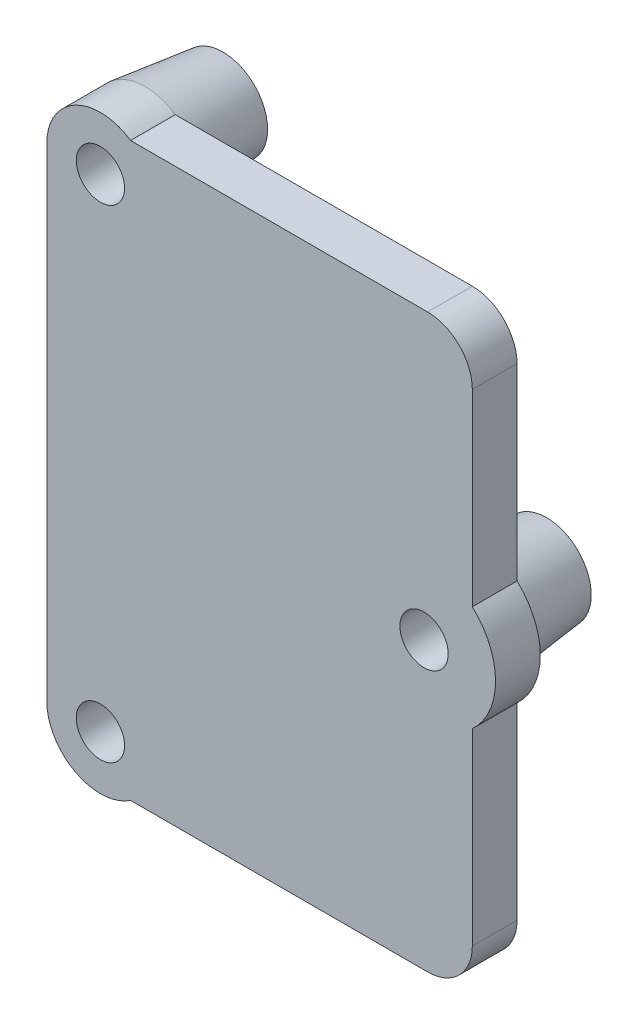
ISO-10303-21;
HEADER;
FILE_DESCRIPTION(('STEP AP214'),'2;1');
FILE_NAME('part.step','',(''),(''),'','','');
FILE_SCHEMA(('AUTOMOTIVE_DESIGN { 1 0 10303 214 1 1 1 1 }'));
ENDSEC;
DATA;
#1=APPLICATION_CONTEXT('core data for automotive mechanical design processes');
#2=APPLICATION_PROTOCOL_DEFINITION('international standard','automotive_design',2000,#1);
#3=PRODUCT_CONTEXT('',#1,'mechanical');
#4=PRODUCT('Part','Part','',(#3));
#5=PRODUCT_RELATED_PRODUCT_CATEGORY('part','',(#4));
#6=PRODUCT_DEFINITION_FORMATION('','',#4);
#7=PRODUCT_DEFINITION_CONTEXT('part definition',#1,'design');
#8=PRODUCT_DEFINITION('design','',#6,#7);
#9=PRODUCT_DEFINITION_SHAPE('','',#8);
#10=(LENGTH_UNIT() NAMED_UNIT(*) SI_UNIT(.MILLI.,.METRE.));
#11=(NAMED_UNIT(*) PLANE_ANGLE_UNIT() SI_UNIT($,.RADIAN.));
#12=(NAMED_UNIT(*) SI_UNIT($,.STERADIAN.) SOLID_ANGLE_UNIT());
#13=UNCERTAINTY_MEASURE_WITH_UNIT(LENGTH_MEASURE(1.E-05),#10,'distance_accuracy_value','');
#14=(GEOMETRIC_REPRESENTATION_CONTEXT(3) GLOBAL_UNCERTAINTY_ASSIGNED_CONTEXT((#13)) GLOBAL_UNIT_ASSIGNED_CONTEXT((#10,
#11,#12)) REPRESENTATION_CONTEXT('',''));
#15=CARTESIAN_POINT('',(0.,0.,0.));
#16=DIRECTION('',(0.,0.,1.));
#17=DIRECTION('',(1.,0.,0.));
#18=AXIS2_PLACEMENT_3D('',#15,#16,#17);
#19=CARTESIAN_POINT('',(0.,0.,0.));
#20=DIRECTION('',(0.,0.,1.));
#21=DIRECTION('',(1.,0.,0.));
#22=AXIS2_PLACEMENT_3D('',#19,#20,#21);
#23=PLANE('',#22);
#24=DIRECTION('',(-1.,0.,0.));
#25=VECTOR('',#24,1.);
#26=CARTESIAN_POINT('',(0.,31.963697294173,0.));
#27=LINE('',#26,#25);
#28=CARTESIAN_POINT('',(18.5,31.963697294173,0.));
#29=VERTEX_POINT('',#28);
#30=CARTESIAN_POINT('',(-14.729286548545,31.963697294173,0.));
#31=VERTEX_POINT('',#30);
#32=EDGE_CURVE('E145',#29,#31,#27,.T.);
#33=ORIENTED_EDGE('',*,*,#32,.F.);
#34=CARTESIAN_POINT('',(18.5,26.963697294173,0.));
#35=DIRECTION('',(0.,0.,1.));
#36=DIRECTION('',(1.,0.,0.));
#37=AXIS2_PLACEMENT_3D('',#34,#35,#36);
#38=CIRCLE('',#37,5.);
#39=CARTESIAN_POINT('',(23.5,26.963697294173,0.));
#40=VERTEX_POINT('',#39);
#41=EDGE_CURVE('E141',#29,#40,#38,.F.);
#42=ORIENTED_EDGE('',*,*,#41,.T.);
#43=DIRECTION('',(0.,-1.,0.));
#44=VECTOR('',#43,1.);
#45=CARTESIAN_POINT('',(23.5,0.,0.));
#46=LINE('',#45,#44);
#47=CARTESIAN_POINT('',(23.5,5.90254182534947,0.));
#48=VERTEX_POINT('',#47);
#49=EDGE_CURVE('E134',#40,#48,#46,.T.);
#50=ORIENTED_EDGE('',*,*,#49,.T.);
#51=CARTESIAN_POINT('',(18.1,0.,0.));
#52=DIRECTION('',(0.,0.,1.));
#53=DIRECTION('',(1.,0.,0.));
#54=AXIS2_PLACEMENT_3D('',#51,#52,#53);
#55=CIRCLE('',#54,7.99999999999999);
#56=CARTESIAN_POINT('',(23.5,-5.90254182534947,0.));
#57=VERTEX_POINT('',#56);
#58=EDGE_CURVE('E139',#57,#48,#55,.T.);
#59=ORIENTED_EDGE('',*,*,#58,.F.);
#60=DIRECTION('',(0.,-1.,0.));
#61=VECTOR('',#60,1.);
#62=CARTESIAN_POINT('',(23.5,0.,0.));
#63=LINE('',#62,#61);
#64=CARTESIAN_POINT('',(23.5,-26.963697294173,0.));
#65=VERTEX_POINT('',#64);
#66=EDGE_CURVE('E218',#57,#65,#63,.T.);
#67=ORIENTED_EDGE('',*,*,#66,.T.);
#68=CARTESIAN_POINT('',(18.5,-26.963697294173,0.));
#69=DIRECTION('',(0.,0.,1.));
#70=DIRECTION('',(1.,0.,0.));
#71=AXIS2_PLACEMENT_3D('',#68,#69,#70);
#72=CIRCLE('',#71,5.);
#73=CARTESIAN_POINT('',(18.5,-31.963697294173,0.));
#74=VERTEX_POINT('',#73);
#75=EDGE_CURVE('E74',#65,#74,#72,.F.);
#76=ORIENTED_EDGE('',*,*,#75,.T.);
#77=DIRECTION('',(-1.,0.,0.));
#78=VECTOR('',#77,1.);
#79=CARTESIAN_POINT('',(0.,-31.963697294173,0.));
#80=LINE('',#79,#78);
#81=CARTESIAN_POINT('',(-14.729286548545,-31.963697294173,0.));
#82=VERTEX_POINT('',#81);
#83=EDGE_CURVE('E205',#74,#82,#80,.T.);
#84=ORIENTED_EDGE('',*,*,#83,.T.);
#85=CARTESIAN_POINT('',(-18.1,-27.,0.));
#86=DIRECTION('',(0.,0.,1.));
#87=DIRECTION('',(1.,0.,0.));
#88=AXIS2_PLACEMENT_3D('',#85,#86,#87);
#89=CIRCLE('',#88,6.);
#90=CARTESIAN_POINT('',(-24.1,-27.,0.));
#91=VERTEX_POINT('',#90);
#92=EDGE_CURVE('E184',#91,#82,#89,.F.);
#93=ORIENTED_EDGE('',*,*,#92,.F.);
#94=DIRECTION('',(0.,-1.,0.));
#95=VECTOR('',#94,1.);
#96=CARTESIAN_POINT('',(-24.1000000000001,-27.0000000000003,0.));
#97=LINE('',#96,#95);
#98=CARTESIAN_POINT('',(-24.1000000000001,27.,5.20417042793042E-13));
#99=VERTEX_POINT('',#98);
#100=EDGE_CURVE('E229',#99,#91,#97,.T.);
#101=ORIENTED_EDGE('',*,*,#100,.F.);
#102=CARTESIAN_POINT('',(-18.1,27.,0.));
#103=DIRECTION('',(0.,0.,1.));
#104=DIRECTION('',(1.,0.,0.));
#105=AXIS2_PLACEMENT_3D('',#102,#103,#104);
#106=CIRCLE('',#105,6.);
#107=EDGE_CURVE('E175',#99,#31,#106,.T.);
#108=ORIENTED_EDGE('',*,*,#107,.T.);
#109=EDGE_LOOP('',(#33,#42,#50,#59,#67,#76,#84,#93,#101,#108));
#110=FACE_BOUND('',#109,.T.);
#111=CARTESIAN_POINT('',(18.1,0.,0.));
#112=DIRECTION('',(0.,0.,1.));
#113=DIRECTION('',(1.,0.,0.));
#114=AXIS2_PLACEMENT_3D('',#111,#112,#113);
#115=CIRCLE('',#114,6.);
#116=CARTESIAN_POINT('',(24.1,0.,0.));
#117=VERTEX_POINT('',#116);
#118=EDGE_CURVE('E188',#117,#117,#115,.F.);
#119=ORIENTED_EDGE('',*,*,#118,.F.);
#120=EDGE_LOOP('',(#119));
#121=FACE_BOUND('',#120,.T.);
#122=ADVANCED_FACE('F59',(#110,#121),#23,.F.);
#123=CARTESIAN_POINT('',(-18.1,-27.,5.));
#124=DIRECTION('',(0.,0.,-1.));
#125=DIRECTION('',(-1.,0.,0.));
#126=AXIS2_PLACEMENT_3D('',#123,#124,#125);
#127=CYLINDRICAL_SURFACE('',#126,6.);
#128=CARTESIAN_POINT('',(-18.1,-27.,0.));
#129=DIRECTION('',(0.,0.,1.));
#130=DIRECTION('',(1.,0.,0.));
#131=AXIS2_PLACEMENT_3D('',#128,#129,#130);
#132=CIRCLE('',#131,6.);
#133=EDGE_CURVE('E163',#91,#82,#132,.T.);
#134=ORIENTED_EDGE('',*,*,#133,.T.);
#135=DIRECTION('',(0.,0.,-1.));
#136=VECTOR('',#135,1.);
#137=CARTESIAN_POINT('',(-14.729286548545,-31.963697294173,5.));
#138=LINE('',#137,#136);
#139=CARTESIAN_POINT('',(-14.729286548545,-31.963697294173,5.));
#140=VERTEX_POINT('',#139);
#141=EDGE_CURVE('E172',#140,#82,#138,.T.);
#142=ORIENTED_EDGE('',*,*,#141,.F.);
#143=CARTESIAN_POINT('',(-18.1,-27.,5.));
#144=DIRECTION('',(0.,0.,1.));
#145=DIRECTION('',(1.,0.,0.));
#146=AXIS2_PLACEMENT_3D('',#143,#144,#145);
#147=CIRCLE('',#146,6.);
#148=CARTESIAN_POINT('',(-24.1000000000001,-27.0000000000003,5.));
#149=VERTEX_POINT('',#148);
#150=EDGE_CURVE('E165',#149,#140,#147,.T.);
#151=ORIENTED_EDGE('',*,*,#150,.F.);
#152=DIRECTION('',(0.,0.,1.));
#153=VECTOR('',#152,1.);
#154=CARTESIAN_POINT('',(-24.1000000000001,-27.0000000000003,-8.701));
#155=LINE('',#154,#153);
#156=EDGE_CURVE('E225',#91,#149,#155,.T.);
#157=ORIENTED_EDGE('',*,*,#156,.F.);
#158=EDGE_LOOP('',(#134,#142,#151,#157));
#159=FACE_BOUND('',#158,.T.);
#160=ADVANCED_FACE('F301',(#159),#127,.T.);
#161=CARTESIAN_POINT('',(18.1,0.,5.));
#162=DIRECTION('',(0.,0.,-1.));
#163=DIRECTION('',(-1.,0.,0.));
#164=AXIS2_PLACEMENT_3D('',#161,#162,#163);
#165=CYLINDRICAL_SURFACE('',#164,7.99999999999999);
#166=ORIENTED_EDGE('',*,*,#58,.T.);
#167=DIRECTION('',(0.,0.,1.));
#168=VECTOR('',#167,1.);
#169=CARTESIAN_POINT('',(23.5,5.90254182534947,-46.2672905450595));
#170=LINE('',#169,#168);
#171=CARTESIAN_POINT('',(23.5,5.90254182534947,5.));
#172=VERTEX_POINT('',#171);
#173=EDGE_CURVE('E149',#48,#172,#170,.T.);
#174=ORIENTED_EDGE('',*,*,#173,.T.);
#175=CARTESIAN_POINT('',(18.1,0.,5.));
#176=DIRECTION('',(0.,0.,1.));
#177=DIRECTION('',(1.,0.,0.));
#178=AXIS2_PLACEMENT_3D('',#175,#176,#177);
#179=CIRCLE('',#178,7.99999999999999);
#180=CARTESIAN_POINT('',(23.5,-5.90254182534947,5.));
#181=VERTEX_POINT('',#180);
#182=EDGE_CURVE('E246',#181,#172,#179,.T.);
#183=ORIENTED_EDGE('',*,*,#182,.F.);
#184=DIRECTION('',(0.,0.,1.));
#185=VECTOR('',#184,1.);
#186=CARTESIAN_POINT('',(23.5,-5.90254182534947,-46.2672905450595));
#187=LINE('',#186,#185);
#188=EDGE_CURVE('E161',#57,#181,#187,.T.);
#189=ORIENTED_EDGE('',*,*,#188,.F.);
#190=EDGE_LOOP('',(#166,#174,#183,#189));
#191=FACE_BOUND('',#190,.T.);
#192=ADVANCED_FACE('F159',(#191),#165,.T.);
#193=CARTESIAN_POINT('',(-18.1,27.,5.));
#194=DIRECTION('',(0.,0.,-1.));
#195=DIRECTION('',(-1.,0.,0.));
#196=AXIS2_PLACEMENT_3D('',#193,#194,#195);
#197=CYLINDRICAL_SURFACE('',#196,6.00000000000006);
#198=CARTESIAN_POINT('',(-18.1,27.,0.));
#199=DIRECTION('',(0.,0.,1.));
#200=DIRECTION('',(1.,0.,0.));
#201=AXIS2_PLACEMENT_3D('',#198,#199,#200);
#202=CIRCLE('',#201,6.00000000000006);
#203=EDGE_CURVE('E162',#31,#99,#202,.T.);
#204=ORIENTED_EDGE('',*,*,#203,.T.);
#205=DIRECTION('',(0.,0.,1.));
#206=VECTOR('',#205,1.);
#207=CARTESIAN_POINT('',(-24.1000000000001,27.,-8.701));
#208=LINE('',#207,#206);
#209=CARTESIAN_POINT('',(-24.1000000000001,27.,5.));
#210=VERTEX_POINT('',#209);
#211=EDGE_CURVE('E226',#99,#210,#208,.T.);
#212=ORIENTED_EDGE('',*,*,#211,.T.);
#213=CARTESIAN_POINT('',(-18.1,27.,5.));
#214=DIRECTION('',(0.,0.,1.));
#215=DIRECTION('',(1.,0.,0.));
#216=AXIS2_PLACEMENT_3D('',#213,#214,#215);
#217=CIRCLE('',#216,6.00000000000006);
#218=CARTESIAN_POINT('',(-14.729286548545,31.963697294173,5.));
#219=VERTEX_POINT('',#218);
#220=EDGE_CURVE('E248',#219,#210,#217,.T.);
#221=ORIENTED_EDGE('',*,*,#220,.F.);
#222=DIRECTION('',(0.,0.,-1.));
#223=VECTOR('',#222,1.);
#224=CARTESIAN_POINT('',(-14.729286548545,31.963697294173,5.));
#225=LINE('',#224,#223);
#226=EDGE_CURVE('E176',#219,#31,#225,.T.);
#227=ORIENTED_EDGE('',*,*,#226,.T.);
#228=EDGE_LOOP('',(#204,#212,#221,#227));
#229=FACE_BOUND('',#228,.T.);
#230=ADVANCED_FACE('F262',(#229),#197,.T.);
#231=CARTESIAN_POINT('',(-18.1,27.,5.));
#232=DIRECTION('',(0.,0.,-1.));
#233=DIRECTION('',(-1.,0.,0.));
#234=AXIS2_PLACEMENT_3D('',#231,#232,#233);
#235=CYLINDRICAL_SURFACE('',#234,2.7);
#236=CARTESIAN_POINT('',(-18.1,27.,5.));
#237=DIRECTION('',(0.,0.,1.));
#238=DIRECTION('',(1.,0.,0.));
#239=AXIS2_PLACEMENT_3D('',#236,#237,#238);
#240=CIRCLE('',#239,2.7);
#241=CARTESIAN_POINT('',(-15.4,27.,5.));
#242=VERTEX_POINT('',#241);
#243=EDGE_CURVE('E253',#242,#242,#240,.T.);
#244=ORIENTED_EDGE('',*,*,#243,.T.);
#245=EDGE_LOOP('',(#244));
#246=FACE_BOUND('',#245,.T.);
#247=CARTESIAN_POINT('',(-18.1,27.,-8.69999999999993));
#248=DIRECTION('',(0.,0.,1.));
#249=DIRECTION('',(1.,0.,0.));
#250=AXIS2_PLACEMENT_3D('',#247,#248,#249);
#251=CIRCLE('',#250,2.70000000000001);
#252=CARTESIAN_POINT('',(-15.4,27.,-8.69999999999993));
#253=VERTEX_POINT('',#252);
#254=EDGE_CURVE('E168',#253,#253,#251,.T.);
#255=ORIENTED_EDGE('',*,*,#254,.F.);
#256=EDGE_LOOP('',(#255));
#257=FACE_BOUND('',#256,.T.);
#258=ADVANCED_FACE('F289',(#246,#257),#235,.F.);
#259=CARTESIAN_POINT('',(18.1,0.,5.));
#260=DIRECTION('',(0.,0.,-1.));
#261=DIRECTION('',(-1.,0.,0.));
#262=AXIS2_PLACEMENT_3D('',#259,#260,#261);
#263=CYLINDRICAL_SURFACE('',#262,2.7);
#264=CARTESIAN_POINT('',(18.1,0.,5.));
#265=DIRECTION('',(0.,0.,1.));
#266=DIRECTION('',(1.,0.,0.));
#267=AXIS2_PLACEMENT_3D('',#264,#265,#266);
#268=CIRCLE('',#267,2.7);
#269=CARTESIAN_POINT('',(20.8,0.,5.));
#270=VERTEX_POINT('',#269);
#271=EDGE_CURVE('E250',#270,#270,#268,.T.);
#272=ORIENTED_EDGE('',*,*,#271,.T.);
#273=EDGE_LOOP('',(#272));
#274=FACE_BOUND('',#273,.T.);
#275=CARTESIAN_POINT('',(18.1,0.,-8.69999999999993));
#276=DIRECTION('',(0.,0.,1.));
#277=DIRECTION('',(1.,0.,0.));
#278=AXIS2_PLACEMENT_3D('',#275,#276,#277);
#279=CIRCLE('',#278,2.7);
#280=CARTESIAN_POINT('',(20.8,0.,-8.69999999999993));
#281=VERTEX_POINT('',#280);
#282=EDGE_CURVE('E146',#281,#281,#279,.T.);
#283=ORIENTED_EDGE('',*,*,#282,.F.);
#284=EDGE_LOOP('',(#283));
#285=FACE_BOUND('',#284,.T.);
#286=ADVANCED_FACE('F286',(#274,#285),#263,.F.);
#287=CARTESIAN_POINT('',(-18.1,-27.,5.));
#288=DIRECTION('',(0.,0.,-1.));
#289=DIRECTION('',(-1.,0.,0.));
#290=AXIS2_PLACEMENT_3D('',#287,#288,#289);
#291=CYLINDRICAL_SURFACE('',#290,2.7);
#292=CARTESIAN_POINT('',(-18.1,-27.,5.));
#293=DIRECTION('',(0.,0.,1.));
#294=DIRECTION('',(1.,0.,0.));
#295=AXIS2_PLACEMENT_3D('',#292,#293,#294);
#296=CIRCLE('',#295,2.7);
#297=CARTESIAN_POINT('',(-15.4,-27.,5.));
#298=VERTEX_POINT('',#297);
#299=EDGE_CURVE('E255',#298,#298,#296,.T.);
#300=ORIENTED_EDGE('',*,*,#299,.T.);
#301=EDGE_LOOP('',(#300));
#302=FACE_BOUND('',#301,.T.);
#303=CARTESIAN_POINT('',(-18.1,-27.,-8.69999999999993));
#304=DIRECTION('',(0.,0.,-1.));
#305=DIRECTION('',(1.,0.,0.));
#306=AXIS2_PLACEMENT_3D('',#303,#304,#305);
#307=CIRCLE('',#306,2.70000000000001);
#308=CARTESIAN_POINT('',(-15.4,-27.,-8.69999999999993));
#309=VERTEX_POINT('',#308);
#310=EDGE_CURVE('E237',#309,#309,#307,.T.);
#311=ORIENTED_EDGE('',*,*,#310,.T.);
#312=EDGE_LOOP('',(#311));
#313=FACE_BOUND('',#312,.T.);
#314=ADVANCED_FACE('F288',(#302,#313),#291,.F.);
#315=CARTESIAN_POINT('',(0.,0.,5.));
#316=DIRECTION('',(0.,0.,1.));
#317=DIRECTION('',(1.,0.,0.));
#318=AXIS2_PLACEMENT_3D('',#315,#316,#317);
#319=PLANE('',#318);
#320=DIRECTION('',(0.,1.,0.));
#321=VECTOR('',#320,1.);
#322=CARTESIAN_POINT('',(23.5,0.,5.));
#323=LINE('',#322,#321);
#324=CARTESIAN_POINT('',(23.5,26.963697294173,5.));
#325=VERTEX_POINT('',#324);
#326=EDGE_CURVE('E152',#172,#325,#323,.T.);
#327=ORIENTED_EDGE('',*,*,#326,.T.);
#328=CARTESIAN_POINT('',(18.5,26.963697294173,5.));
#329=DIRECTION('',(0.,0.,1.));
#330=DIRECTION('',(1.,0.,0.));
#331=AXIS2_PLACEMENT_3D('',#328,#329,#330);
#332=CIRCLE('',#331,5.);
#333=CARTESIAN_POINT('',(18.5,31.963697294173,5.));
#334=VERTEX_POINT('',#333);
#335=EDGE_CURVE('E193',#325,#334,#332,.T.);
#336=ORIENTED_EDGE('',*,*,#335,.T.);
#337=DIRECTION('',(1.,0.,0.));
#338=VECTOR('',#337,1.);
#339=CARTESIAN_POINT('',(0.,31.963697294173,5.));
#340=LINE('',#339,#338);
#341=EDGE_CURVE('E156',#219,#334,#340,.T.);
#342=ORIENTED_EDGE('',*,*,#341,.F.);
#343=ORIENTED_EDGE('',*,*,#220,.T.);
#344=DIRECTION('',(0.,1.,0.));
#345=VECTOR('',#344,1.);
#346=CARTESIAN_POINT('',(-24.1000000000001,-27.0000000000003,5.));
#347=LINE('',#346,#345);
#348=EDGE_CURVE('E222',#149,#210,#347,.T.);
#349=ORIENTED_EDGE('',*,*,#348,.F.);
#350=ORIENTED_EDGE('',*,*,#150,.T.);
#351=DIRECTION('',(1.,0.,0.));
#352=VECTOR('',#351,1.);
#353=CARTESIAN_POINT('',(0.,-31.963697294173,5.));
#354=LINE('',#353,#352);
#355=CARTESIAN_POINT('',(18.5,-31.963697294173,5.));
#356=VERTEX_POINT('',#355);
#357=EDGE_CURVE('E203',#140,#356,#354,.T.);
#358=ORIENTED_EDGE('',*,*,#357,.T.);
#359=CARTESIAN_POINT('',(18.5,-26.963697294173,5.));
#360=DIRECTION('',(0.,0.,1.));
#361=DIRECTION('',(1.,0.,0.));
#362=AXIS2_PLACEMENT_3D('',#359,#360,#361);
#363=CIRCLE('',#362,5.);
#364=CARTESIAN_POINT('',(23.5,-26.963697294173,5.));
#365=VERTEX_POINT('',#364);
#366=EDGE_CURVE('E210',#356,#365,#363,.T.);
#367=ORIENTED_EDGE('',*,*,#366,.T.);
#368=DIRECTION('',(0.,1.,0.));
#369=VECTOR('',#368,1.);
#370=CARTESIAN_POINT('',(23.5,0.,5.));
#371=LINE('',#370,#369);
#372=EDGE_CURVE('E213',#365,#181,#371,.T.);
#373=ORIENTED_EDGE('',*,*,#372,.T.);
#374=ORIENTED_EDGE('',*,*,#182,.T.);
#375=EDGE_LOOP('',(#327,#336,#342,#343,#349,#350,#358,#367,#373,#374));
#376=FACE_BOUND('',#375,.T.);
#377=ORIENTED_EDGE('',*,*,#271,.F.);
#378=EDGE_LOOP('',(#377));
#379=FACE_BOUND('',#378,.T.);
#380=ORIENTED_EDGE('',*,*,#243,.F.);
#381=EDGE_LOOP('',(#380));
#382=FACE_BOUND('',#381,.T.);
#383=ORIENTED_EDGE('',*,*,#299,.F.);
#384=EDGE_LOOP('',(#383));
#385=FACE_BOUND('',#384,.T.);
#386=ADVANCED_FACE('F208',(#376,#379,#382,#385),#319,.T.);
#387=CARTESIAN_POINT('',(-24.9359860396497,16.9333580570705,-8.69999999999997));
#388=DIRECTION('',(0.,0.,-1.));
#389=DIRECTION('',(-1.,0.,0.));
#390=AXIS2_PLACEMENT_3D('',#387,#388,#389);
#391=PLANE('',#390);
#392=ORIENTED_EDGE('',*,*,#254,.T.);
#393=EDGE_LOOP('',(#392));
#394=FACE_BOUND('',#393,.T.);
#395=CARTESIAN_POINT('',(-18.1,27.,-8.69999999999993));
#396=DIRECTION('',(0.,0.,1.));
#397=DIRECTION('',(1.,0.,0.));
#398=AXIS2_PLACEMENT_3D('',#395,#396,#397);
#399=CIRCLE('',#398,5.);
#400=CARTESIAN_POINT('',(-13.1,27.,-8.69999999999993));
#401=VERTEX_POINT('',#400);
#402=EDGE_CURVE('E240',#401,#401,#399,.T.);
#403=ORIENTED_EDGE('',*,*,#402,.F.);
#404=EDGE_LOOP('',(#403));
#405=FACE_BOUND('',#404,.T.);
#406=ADVANCED_FACE('F311',(#394,#405),#391,.T.);
#407=CARTESIAN_POINT('',(-18.1,27.,-8.69999999999993));
#408=DIRECTION('',(0.,0.,1.));
#409=DIRECTION('',(1.,0.,0.));
#410=AXIS2_PLACEMENT_3D('',#407,#408,#409);
#411=CONICAL_SURFACE('',#410,5.,0.114440305270065);
#412=ORIENTED_EDGE('',*,*,#203,.F.);
#413=ORIENTED_EDGE('',*,*,#107,.F.);
#414=EDGE_LOOP('',(#412,#413));
#415=FACE_BOUND('',#414,.T.);
#416=ORIENTED_EDGE('',*,*,#402,.T.);
#417=EDGE_LOOP('',(#416));
#418=FACE_BOUND('',#417,.T.);
#419=ADVANCED_FACE('F314',(#415,#418),#411,.T.);
#420=CARTESIAN_POINT('',(-24.9359860396497,-16.9333580570705,-8.69999999999997));
#421=DIRECTION('',(0.,0.,-1.));
#422=DIRECTION('',(-1.,0.,0.));
#423=AXIS2_PLACEMENT_3D('',#420,#421,#422);
#424=PLANE('',#423);
#425=ORIENTED_EDGE('',*,*,#310,.F.);
#426=EDGE_LOOP('',(#425));
#427=FACE_BOUND('',#426,.T.);
#428=CARTESIAN_POINT('',(-18.1,-27.,-8.69999999999993));
#429=DIRECTION('',(0.,0.,-1.));
#430=DIRECTION('',(1.,0.,0.));
#431=AXIS2_PLACEMENT_3D('',#428,#429,#430);
#432=CIRCLE('',#431,5.);
#433=CARTESIAN_POINT('',(-13.1,-27.,-8.69999999999993));
#434=VERTEX_POINT('',#433);
#435=EDGE_CURVE('E234',#434,#434,#432,.T.);
#436=ORIENTED_EDGE('',*,*,#435,.T.);
#437=EDGE_LOOP('',(#436));
#438=FACE_BOUND('',#437,.T.);
#439=ADVANCED_FACE('F318',(#427,#438),#424,.T.);
#440=CARTESIAN_POINT('',(-18.1,-27.,-8.69999999999993));
#441=DIRECTION('',(0.,0.,1.));
#442=DIRECTION('',(1.,0.,0.));
#443=AXIS2_PLACEMENT_3D('',#440,#441,#442);
#444=CONICAL_SURFACE('',#443,5.,0.114440305270065);
#445=ORIENTED_EDGE('',*,*,#133,.F.);
#446=ORIENTED_EDGE('',*,*,#92,.T.);
#447=EDGE_LOOP('',(#445,#446));
#448=FACE_BOUND('',#447,.T.);
#449=ORIENTED_EDGE('',*,*,#435,.F.);
#450=EDGE_LOOP('',(#449));
#451=FACE_BOUND('',#450,.T.);
#452=ADVANCED_FACE('F322',(#448,#451),#444,.T.);
#453=CARTESIAN_POINT('',(-24.1000000000001,-27.0000000000003,-8.701));
#454=DIRECTION('',(1.,0.,0.));
#455=DIRECTION('',(0.,0.,-1.));
#456=AXIS2_PLACEMENT_3D('',#453,#454,#455);
#457=PLANE('',#456);
#458=ORIENTED_EDGE('',*,*,#100,.T.);
#459=ORIENTED_EDGE('',*,*,#156,.T.);
#460=ORIENTED_EDGE('',*,*,#348,.T.);
#461=ORIENTED_EDGE('',*,*,#211,.F.);
#462=EDGE_LOOP('',(#458,#459,#460,#461));
#463=FACE_BOUND('',#462,.T.);
#464=ADVANCED_FACE('F326',(#463),#457,.F.);
#465=CARTESIAN_POINT('',(23.5,0.,-46.2672905450595));
#466=DIRECTION('',(1.,0.,0.));
#467=DIRECTION('',(0.,0.,-1.));
#468=AXIS2_PLACEMENT_3D('',#465,#466,#467);
#469=PLANE('',#468);
#470=ORIENTED_EDGE('',*,*,#372,.F.);
#471=DIRECTION('',(0.,0.,1.));
#472=VECTOR('',#471,1.);
#473=CARTESIAN_POINT('',(23.5,-26.963697294173,-46.2672905450595));
#474=LINE('',#473,#472);
#475=EDGE_CURVE('E12',#365,#65,#474,.F.);
#476=ORIENTED_EDGE('',*,*,#475,.T.);
#477=ORIENTED_EDGE('',*,*,#66,.F.);
#478=ORIENTED_EDGE('',*,*,#188,.T.);
#479=EDGE_LOOP('',(#470,#476,#477,#478));
#480=FACE_BOUND('',#479,.T.);
#481=ADVANCED_FACE('F330',(#480),#469,.T.);
#482=CARTESIAN_POINT('',(0.,-31.963697294173,-46.2672905450595));
#483=DIRECTION('',(0.,-1.,0.));
#484=DIRECTION('',(0.,0.,-1.));
#485=AXIS2_PLACEMENT_3D('',#482,#483,#484);
#486=PLANE('',#485);
#487=ORIENTED_EDGE('',*,*,#83,.F.);
#488=DIRECTION('',(0.,0.,1.));
#489=VECTOR('',#488,1.);
#490=CARTESIAN_POINT('',(18.5,-31.963697294173,-46.2672905450595));
#491=LINE('',#490,#489);
#492=EDGE_CURVE('E67',#74,#356,#491,.T.);
#493=ORIENTED_EDGE('',*,*,#492,.T.);
#494=ORIENTED_EDGE('',*,*,#357,.F.);
#495=ORIENTED_EDGE('',*,*,#141,.T.);
#496=EDGE_LOOP('',(#487,#493,#494,#495));
#497=FACE_BOUND('',#496,.T.);
#498=ADVANCED_FACE('F202',(#497),#486,.T.);
#499=CARTESIAN_POINT('',(0.,31.963697294173,-46.2672905450595));
#500=DIRECTION('',(0.,-1.,0.));
#501=DIRECTION('',(0.,0.,-1.));
#502=AXIS2_PLACEMENT_3D('',#499,#500,#501);
#503=PLANE('',#502);
#504=ORIENTED_EDGE('',*,*,#341,.T.);
#505=DIRECTION('',(0.,0.,1.));
#506=VECTOR('',#505,1.);
#507=CARTESIAN_POINT('',(18.5,31.963697294173,0.));
#508=LINE('',#507,#506);
#509=EDGE_CURVE('E195',#334,#29,#508,.F.);
#510=ORIENTED_EDGE('',*,*,#509,.T.);
#511=ORIENTED_EDGE('',*,*,#32,.T.);
#512=ORIENTED_EDGE('',*,*,#226,.F.);
#513=EDGE_LOOP('',(#504,#510,#511,#512));
#514=FACE_BOUND('',#513,.T.);
#515=ADVANCED_FACE('F268',(#514),#503,.F.);
#516=CARTESIAN_POINT('',(23.5,0.,-46.2672905450595));
#517=DIRECTION('',(1.,0.,0.));
#518=DIRECTION('',(0.,0.,-1.));
#519=AXIS2_PLACEMENT_3D('',#516,#517,#518);
#520=PLANE('',#519);
#521=ORIENTED_EDGE('',*,*,#49,.F.);
#522=DIRECTION('',(0.,0.,1.));
#523=VECTOR('',#522,1.);
#524=CARTESIAN_POINT('',(23.5,26.963697294173,5.));
#525=LINE('',#524,#523);
#526=EDGE_CURVE('E349',#40,#325,#525,.T.);
#527=ORIENTED_EDGE('',*,*,#526,.T.);
#528=ORIENTED_EDGE('',*,*,#326,.F.);
#529=ORIENTED_EDGE('',*,*,#173,.F.);
#530=EDGE_LOOP('',(#521,#527,#528,#529));
#531=FACE_BOUND('',#530,.T.);
#532=ADVANCED_FACE('F150',(#531),#520,.T.);
#533=CARTESIAN_POINT('',(6.46986427646805,8.67441062252384,-8.69999999999993));
#534=DIRECTION('',(0.,0.,1.));
#535=DIRECTION('',(1.,0.,0.));
#536=AXIS2_PLACEMENT_3D('',#533,#534,#535);
#537=PLANE('',#536);
#538=CARTESIAN_POINT('',(18.1,0.,-8.69999999999993));
#539=DIRECTION('',(0.,0.,1.));
#540=DIRECTION('',(1.,0.,0.));
#541=AXIS2_PLACEMENT_3D('',#538,#539,#540);
#542=CIRCLE('',#541,5.);
#543=CARTESIAN_POINT('',(23.1,0.,-8.69999999999993));
#544=VERTEX_POINT('',#543);
#545=EDGE_CURVE('E274',#544,#544,#542,.T.);
#546=ORIENTED_EDGE('',*,*,#545,.F.);
#547=EDGE_LOOP('',(#546));
#548=FACE_BOUND('',#547,.T.);
#549=ORIENTED_EDGE('',*,*,#282,.T.);
#550=EDGE_LOOP('',(#549));
#551=FACE_BOUND('',#550,.T.);
#552=ADVANCED_FACE('F280',(#548,#551),#537,.F.);
#553=CARTESIAN_POINT('',(18.1,0.,-8.69999999999993));
#554=DIRECTION('',(0.,0.,1.));
#555=DIRECTION('',(1.,0.,0.));
#556=AXIS2_PLACEMENT_3D('',#553,#554,#555);
#557=CONICAL_SURFACE('',#556,5.,0.114440305270065);
#558=ORIENTED_EDGE('',*,*,#118,.T.);
#559=EDGE_LOOP('',(#558));
#560=FACE_BOUND('',#559,.T.);
#561=ORIENTED_EDGE('',*,*,#545,.T.);
#562=EDGE_LOOP('',(#561));
#563=FACE_BOUND('',#562,.T.);
#564=ADVANCED_FACE('F278',(#560,#563),#557,.T.);
#565=CARTESIAN_POINT('',(18.5,26.963697294173,-46.2672905450595));
#566=DIRECTION('',(0.,0.,-1.));
#567=DIRECTION('',(-1.,0.,0.));
#568=AXIS2_PLACEMENT_3D('',#565,#566,#567);
#569=CYLINDRICAL_SURFACE('',#568,5.);
#570=ORIENTED_EDGE('',*,*,#41,.F.);
#571=ORIENTED_EDGE('',*,*,#509,.F.);
#572=ORIENTED_EDGE('',*,*,#335,.F.);
#573=ORIENTED_EDGE('',*,*,#526,.F.);
#574=EDGE_LOOP('',(#570,#571,#572,#573));
#575=FACE_BOUND('',#574,.T.);
#576=ADVANCED_FACE('F341',(#575),#569,.T.);
#577=CARTESIAN_POINT('',(18.5,-26.963697294173,-46.2672905450595));
#578=DIRECTION('',(0.,0.,1.));
#579=DIRECTION('',(1.,0.,0.));
#580=AXIS2_PLACEMENT_3D('',#577,#578,#579);
#581=CYLINDRICAL_SURFACE('',#580,5.);
#582=ORIENTED_EDGE('',*,*,#75,.F.);
#583=ORIENTED_EDGE('',*,*,#475,.F.);
#584=ORIENTED_EDGE('',*,*,#366,.F.);
#585=ORIENTED_EDGE('',*,*,#492,.F.);
#586=EDGE_LOOP('',(#582,#583,#584,#585));
#587=FACE_BOUND('',#586,.T.);
#588=ADVANCED_FACE('F61',(#587),#581,.T.);
#589=CLOSED_SHELL('',(#122,#160,#192,#230,#258,#286,#314,#386,#406,#419,#439,#452,#464,#481,
#498,#515,#532,#552,#564,#576,#588));
#590=MANIFOLD_SOLID_BREP('B2',#589);
#591=ADVANCED_BREP_SHAPE_REPRESENTATION('',(#18,#590),#14);
#592=SHAPE_DEFINITION_REPRESENTATION(#9,#591);
ENDSEC;
END-ISO-10303-21;
